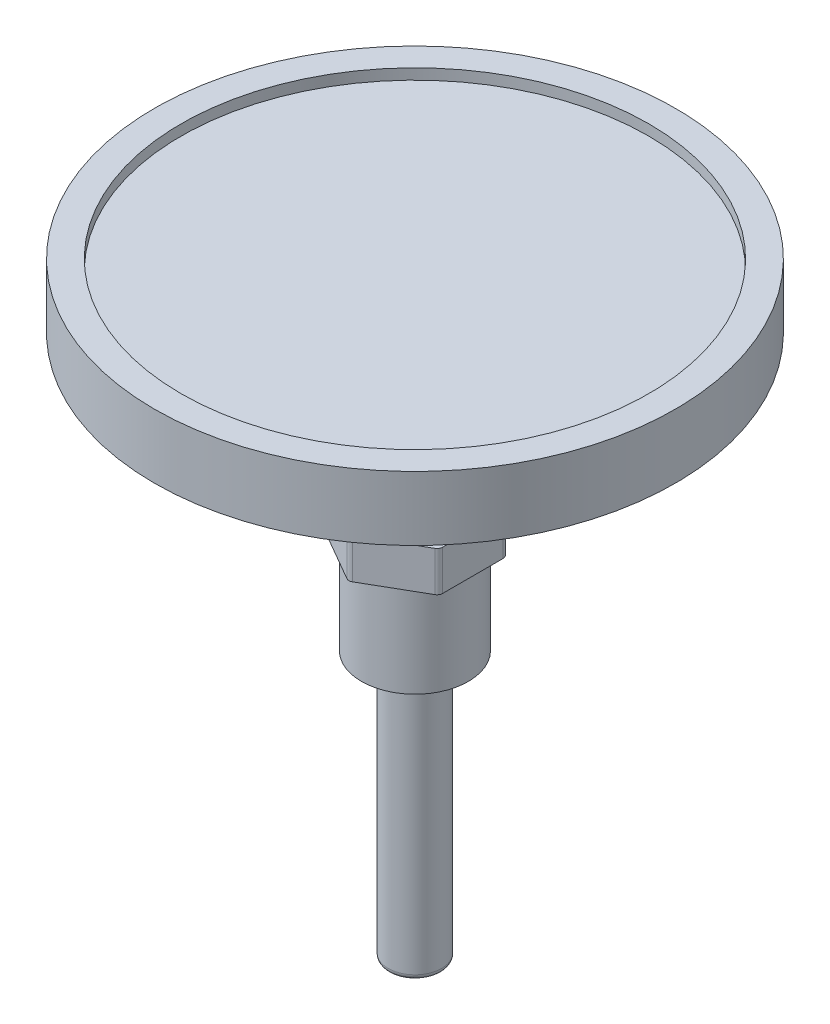
ISO-10303-21;
HEADER;
FILE_DESCRIPTION(('STEP AP214'),'2;1');
FILE_NAME('part.step','',(''),(''),'','','');
FILE_SCHEMA(('AUTOMOTIVE_DESIGN { 1 0 10303 214 1 1 1 1 }'));
ENDSEC;
DATA;
#1=APPLICATION_CONTEXT('core data for automotive mechanical design processes');
#2=APPLICATION_PROTOCOL_DEFINITION('international standard','automotive_design',2000,#1);
#3=PRODUCT_CONTEXT('',#1,'mechanical');
#4=PRODUCT('Part','Part','',(#3));
#5=PRODUCT_RELATED_PRODUCT_CATEGORY('part','',(#4));
#6=PRODUCT_DEFINITION_FORMATION('','',#4);
#7=PRODUCT_DEFINITION_CONTEXT('part definition',#1,'design');
#8=PRODUCT_DEFINITION('design','',#6,#7);
#9=PRODUCT_DEFINITION_SHAPE('','',#8);
#10=(LENGTH_UNIT() NAMED_UNIT(*) SI_UNIT(.MILLI.,.METRE.));
#11=(NAMED_UNIT(*) PLANE_ANGLE_UNIT() SI_UNIT($,.RADIAN.));
#12=(NAMED_UNIT(*) SI_UNIT($,.STERADIAN.) SOLID_ANGLE_UNIT());
#13=UNCERTAINTY_MEASURE_WITH_UNIT(LENGTH_MEASURE(1.E-05),#10,'distance_accuracy_value','');
#14=(GEOMETRIC_REPRESENTATION_CONTEXT(3) GLOBAL_UNCERTAINTY_ASSIGNED_CONTEXT((#13)) GLOBAL_UNIT_ASSIGNED_CONTEXT((#10,
#11,#12)) REPRESENTATION_CONTEXT('',''));
#15=CARTESIAN_POINT('',(0.,0.,0.));
#16=DIRECTION('',(0.,0.,1.));
#17=DIRECTION('',(1.,0.,0.));
#18=AXIS2_PLACEMENT_3D('',#15,#16,#17);
#19=CARTESIAN_POINT('',(0.,75.,0.));
#20=DIRECTION('',(0.,1.,0.));
#21=DIRECTION('',(0.,0.,1.));
#22=AXIS2_PLACEMENT_3D('',#19,#20,#21);
#23=PLANE('',#22);
#24=DIRECTION('',(0.,0.,-1.));
#25=VECTOR('',#24,1.);
#26=CARTESIAN_POINT('',(10.8253175473055,75.,6.25));
#27=LINE('',#26,#25);
#28=CARTESIAN_POINT('',(10.8253175473055,75.,5.67264973081038));
#29=VERTEX_POINT('',#28);
#30=CARTESIAN_POINT('',(10.8253175473055,75.,-5.67264973081037));
#31=VERTEX_POINT('',#30);
#32=EDGE_CURVE('E341',#29,#31,#27,.T.);
#33=ORIENTED_EDGE('',*,*,#32,.T.);
#34=CARTESIAN_POINT('',(9.82531754730547,75.,-5.67264973081037));
#35=DIRECTION('',(0.,1.,0.));
#36=DIRECTION('',(0.,0.,1.));
#37=AXIS2_PLACEMENT_3D('',#34,#35,#36);
#38=CIRCLE('',#37,1.);
#39=CARTESIAN_POINT('',(10.3253175473055,75.,-6.53867513459481));
#40=VERTEX_POINT('',#39);
#41=EDGE_CURVE('E203',#31,#40,#38,.T.);
#42=ORIENTED_EDGE('',*,*,#41,.T.);
#43=DIRECTION('',(-0.866025403784439,0.,-0.5));
#44=VECTOR('',#43,1.);
#45=CARTESIAN_POINT('',(10.8253175473055,75.,-6.25));
#46=LINE('',#45,#44);
#47=CARTESIAN_POINT('',(0.5,75.,-12.2113248654052));
#48=VERTEX_POINT('',#47);
#49=EDGE_CURVE('E147',#40,#48,#46,.T.);
#50=ORIENTED_EDGE('',*,*,#49,.T.);
#51=CARTESIAN_POINT('',(0.,75.,-11.3452994616207));
#52=DIRECTION('',(0.,1.,0.));
#53=DIRECTION('',(0.,0.,1.));
#54=AXIS2_PLACEMENT_3D('',#51,#52,#53);
#55=CIRCLE('',#54,1.);
#56=CARTESIAN_POINT('',(-0.5,75.,-12.2113248654052));
#57=VERTEX_POINT('',#56);
#58=EDGE_CURVE('E194',#48,#57,#55,.T.);
#59=ORIENTED_EDGE('',*,*,#58,.T.);
#60=DIRECTION('',(-0.866025403784439,0.,0.5));
#61=VECTOR('',#60,1.);
#62=CARTESIAN_POINT('',(0.,75.,-12.5));
#63=LINE('',#62,#61);
#64=CARTESIAN_POINT('',(-10.3253175473055,75.,-6.53867513459481));
#65=VERTEX_POINT('',#64);
#66=EDGE_CURVE('E317',#57,#65,#63,.T.);
#67=ORIENTED_EDGE('',*,*,#66,.T.);
#68=CARTESIAN_POINT('',(-9.82531754730548,75.,-5.67264973081037));
#69=DIRECTION('',(0.,1.,0.));
#70=DIRECTION('',(0.,0.,1.));
#71=AXIS2_PLACEMENT_3D('',#68,#69,#70);
#72=CIRCLE('',#71,1.);
#73=CARTESIAN_POINT('',(-10.8253175473055,75.,-5.67264973081037));
#74=VERTEX_POINT('',#73);
#75=EDGE_CURVE('E196',#65,#74,#72,.T.);
#76=ORIENTED_EDGE('',*,*,#75,.T.);
#77=DIRECTION('',(0.,0.,1.));
#78=VECTOR('',#77,1.);
#79=CARTESIAN_POINT('',(-10.8253175473055,75.,-6.25));
#80=LINE('',#79,#78);
#81=CARTESIAN_POINT('',(-10.8253175473055,75.,5.67264973081037));
#82=VERTEX_POINT('',#81);
#83=EDGE_CURVE('E315',#74,#82,#80,.T.);
#84=ORIENTED_EDGE('',*,*,#83,.T.);
#85=CARTESIAN_POINT('',(-9.82531754730548,75.,5.67264973081037));
#86=DIRECTION('',(0.,1.,0.));
#87=DIRECTION('',(0.,0.,1.));
#88=AXIS2_PLACEMENT_3D('',#85,#86,#87);
#89=CIRCLE('',#88,1.);
#90=CARTESIAN_POINT('',(-10.3253175473055,75.,6.53867513459481));
#91=VERTEX_POINT('',#90);
#92=EDGE_CURVE('E58',#82,#91,#89,.T.);
#93=ORIENTED_EDGE('',*,*,#92,.T.);
#94=DIRECTION('',(0.866025403784439,0.,0.5));
#95=VECTOR('',#94,1.);
#96=CARTESIAN_POINT('',(-10.8253175473055,75.,6.25));
#97=LINE('',#96,#95);
#98=CARTESIAN_POINT('',(-0.499999999999999,75.,12.2113248654052));
#99=VERTEX_POINT('',#98);
#100=EDGE_CURVE('E176',#91,#99,#97,.T.);
#101=ORIENTED_EDGE('',*,*,#100,.T.);
#102=CARTESIAN_POINT('',(0.,75.,11.3452994616207));
#103=DIRECTION('',(0.,1.,0.));
#104=DIRECTION('',(0.,0.,1.));
#105=AXIS2_PLACEMENT_3D('',#102,#103,#104);
#106=CIRCLE('',#105,1.);
#107=CARTESIAN_POINT('',(0.500000000000001,75.,12.2113248654052));
#108=VERTEX_POINT('',#107);
#109=EDGE_CURVE('E199',#99,#108,#106,.T.);
#110=ORIENTED_EDGE('',*,*,#109,.T.);
#111=DIRECTION('',(0.866025403784439,0.,-0.5));
#112=VECTOR('',#111,1.);
#113=CARTESIAN_POINT('',(0.,75.,12.5));
#114=LINE('',#113,#112);
#115=CARTESIAN_POINT('',(10.3253175473055,75.,6.53867513459481));
#116=VERTEX_POINT('',#115);
#117=EDGE_CURVE('E168',#108,#116,#114,.T.);
#118=ORIENTED_EDGE('',*,*,#117,.T.);
#119=CARTESIAN_POINT('',(9.82531754730547,75.,5.67264973081038));
#120=DIRECTION('',(0.,1.,0.));
#121=DIRECTION('',(0.,0.,1.));
#122=AXIS2_PLACEMENT_3D('',#119,#120,#121);
#123=CIRCLE('',#122,1.);
#124=EDGE_CURVE('E201',#116,#29,#123,.T.);
#125=ORIENTED_EDGE('',*,*,#124,.T.);
#126=EDGE_LOOP('',(#33,#42,#50,#59,#67,#76,#84,#93,#101,#110,#118,#125));
#127=FACE_BOUND('',#126,.T.);
#128=CARTESIAN_POINT('',(0.,75.,0.));
#129=DIRECTION('',(0.,1.,0.));
#130=DIRECTION('',(0.,0.,1.));
#131=AXIS2_PLACEMENT_3D('',#128,#129,#130);
#132=CIRCLE('',#131,8.5);
#133=CARTESIAN_POINT('',(0.,75.,8.5));
#134=VERTEX_POINT('',#133);
#135=EDGE_CURVE('E329',#134,#134,#132,.T.);
#136=ORIENTED_EDGE('',*,*,#135,.F.);
#137=EDGE_LOOP('',(#136));
#138=FACE_BOUND('',#137,.T.);
#139=ADVANCED_FACE('F36',(#127,#138),#23,.T.);
#140=CARTESIAN_POINT('',(0.,50.,0.));
#141=DIRECTION('',(0.,-1.,0.));
#142=DIRECTION('',(0.,0.,-1.));
#143=AXIS2_PLACEMENT_3D('',#140,#141,#142);
#144=CYLINDRICAL_SURFACE('',#143,5.);
#145=CARTESIAN_POINT('',(0.,1.,0.));
#146=DIRECTION('',(0.,1.,0.));
#147=DIRECTION('',(0.,0.,1.));
#148=AXIS2_PLACEMENT_3D('',#145,#146,#147);
#149=CIRCLE('',#148,5.);
#150=CARTESIAN_POINT('',(0.,1.,5.));
#151=VERTEX_POINT('',#150);
#152=EDGE_CURVE('E44',#151,#151,#149,.T.);
#153=ORIENTED_EDGE('',*,*,#152,.T.);
#154=EDGE_LOOP('',(#153));
#155=FACE_BOUND('',#154,.T.);
#156=CARTESIAN_POINT('',(0.,50.,0.));
#157=DIRECTION('',(0.,1.,0.));
#158=DIRECTION('',(0.,0.,1.));
#159=AXIS2_PLACEMENT_3D('',#156,#157,#158);
#160=CIRCLE('',#159,5.);
#161=CARTESIAN_POINT('',(0.,50.,5.));
#162=VERTEX_POINT('',#161);
#163=EDGE_CURVE('E172',#162,#162,#160,.T.);
#164=ORIENTED_EDGE('',*,*,#163,.F.);
#165=EDGE_LOOP('',(#164));
#166=FACE_BOUND('',#165,.T.);
#167=ADVANCED_FACE('F226',(#155,#166),#144,.T.);
#168=CARTESIAN_POINT('',(0.,0.,0.));
#169=DIRECTION('',(0.,1.,0.));
#170=DIRECTION('',(0.,0.,1.));
#171=AXIS2_PLACEMENT_3D('',#168,#169,#170);
#172=PLANE('',#171);
#173=CARTESIAN_POINT('',(0.,0.,0.));
#174=DIRECTION('',(0.,1.,0.));
#175=DIRECTION('',(0.,0.,1.));
#176=AXIS2_PLACEMENT_3D('',#173,#174,#175);
#177=CIRCLE('',#176,4.);
#178=CARTESIAN_POINT('',(0.,0.,4.));
#179=VERTEX_POINT('',#178);
#180=EDGE_CURVE('E11',#179,#179,#177,.F.);
#181=ORIENTED_EDGE('',*,*,#180,.T.);
#182=EDGE_LOOP('',(#181));
#183=FACE_BOUND('',#182,.T.);
#184=ADVANCED_FACE('F243',(#183),#172,.F.);
#185=CARTESIAN_POINT('',(0.,50.,0.));
#186=DIRECTION('',(0.,1.,0.));
#187=DIRECTION('',(0.,0.,1.));
#188=AXIS2_PLACEMENT_3D('',#185,#186,#187);
#189=PLANE('',#188);
#190=CARTESIAN_POINT('',(0.,50.,0.));
#191=DIRECTION('',(0.,1.,0.));
#192=DIRECTION('',(0.,0.,1.));
#193=AXIS2_PLACEMENT_3D('',#190,#191,#192);
#194=CIRCLE('',#193,10.);
#195=CARTESIAN_POINT('',(0.,50.,10.));
#196=VERTEX_POINT('',#195);
#197=EDGE_CURVE('E173',#196,#196,#194,.T.);
#198=ORIENTED_EDGE('',*,*,#197,.F.);
#199=EDGE_LOOP('',(#198));
#200=FACE_BOUND('',#199,.T.);
#201=ORIENTED_EDGE('',*,*,#163,.T.);
#202=EDGE_LOOP('',(#201));
#203=FACE_BOUND('',#202,.T.);
#204=ADVANCED_FACE('F275',(#200,#203),#189,.F.);
#205=CARTESIAN_POINT('',(0.,67.5,0.));
#206=DIRECTION('',(0.,-1.,0.));
#207=DIRECTION('',(0.,0.,-1.));
#208=AXIS2_PLACEMENT_3D('',#205,#206,#207);
#209=CYLINDRICAL_SURFACE('',#208,10.);
#210=CARTESIAN_POINT('',(0.,67.5,0.));
#211=DIRECTION('',(0.,1.,0.));
#212=DIRECTION('',(0.,0.,1.));
#213=AXIS2_PLACEMENT_3D('',#210,#211,#212);
#214=CIRCLE('',#213,10.);
#215=CARTESIAN_POINT('',(0.,67.5,10.));
#216=VERTEX_POINT('',#215);
#217=EDGE_CURVE('E169',#216,#216,#214,.T.);
#218=ORIENTED_EDGE('',*,*,#217,.F.);
#219=EDGE_LOOP('',(#218));
#220=FACE_BOUND('',#219,.T.);
#221=ORIENTED_EDGE('',*,*,#197,.T.);
#222=EDGE_LOOP('',(#221));
#223=FACE_BOUND('',#222,.T.);
#224=ADVANCED_FACE('F254',(#220,#223),#209,.T.);
#225=CARTESIAN_POINT('',(0.,67.5,0.));
#226=DIRECTION('',(0.,1.,0.));
#227=DIRECTION('',(0.,0.,1.));
#228=AXIS2_PLACEMENT_3D('',#225,#226,#227);
#229=PLANE('',#228);
#230=DIRECTION('',(-0.866025403784439,0.,-0.5));
#231=VECTOR('',#230,1.);
#232=CARTESIAN_POINT('',(10.8253175473055,67.5,-6.25));
#233=LINE('',#232,#231);
#234=CARTESIAN_POINT('',(10.3253175473055,67.5,-6.53867513459481));
#235=VERTEX_POINT('',#234);
#236=CARTESIAN_POINT('',(0.5,67.5,-12.2113248654052));
#237=VERTEX_POINT('',#236);
#238=EDGE_CURVE('E144',#235,#237,#233,.T.);
#239=ORIENTED_EDGE('',*,*,#238,.F.);
#240=CARTESIAN_POINT('',(9.82531754730547,67.5,-5.67264973081037));
#241=DIRECTION('',(0.,1.,0.));
#242=DIRECTION('',(0.,0.,1.));
#243=AXIS2_PLACEMENT_3D('',#240,#241,#242);
#244=CIRCLE('',#243,1.);
#245=CARTESIAN_POINT('',(10.8253175473055,67.5,-5.67264973081037));
#246=VERTEX_POINT('',#245);
#247=EDGE_CURVE('E127',#235,#246,#244,.F.);
#248=ORIENTED_EDGE('',*,*,#247,.T.);
#249=DIRECTION('',(0.,0.,-1.));
#250=VECTOR('',#249,1.);
#251=CARTESIAN_POINT('',(10.8253175473055,67.5,6.25));
#252=LINE('',#251,#250);
#253=CARTESIAN_POINT('',(10.8253175473055,67.5,5.67264973081038));
#254=VERTEX_POINT('',#253);
#255=EDGE_CURVE('E155',#254,#246,#252,.T.);
#256=ORIENTED_EDGE('',*,*,#255,.F.);
#257=CARTESIAN_POINT('',(9.82531754730547,67.5,5.67264973081038));
#258=DIRECTION('',(0.,1.,0.));
#259=DIRECTION('',(0.,0.,1.));
#260=AXIS2_PLACEMENT_3D('',#257,#258,#259);
#261=CIRCLE('',#260,1.);
#262=CARTESIAN_POINT('',(10.3253175473055,67.5,6.53867513459481));
#263=VERTEX_POINT('',#262);
#264=EDGE_CURVE('E138',#254,#263,#261,.F.);
#265=ORIENTED_EDGE('',*,*,#264,.T.);
#266=DIRECTION('',(0.866025403784439,0.,-0.5));
#267=VECTOR('',#266,1.);
#268=CARTESIAN_POINT('',(0.,67.5,12.5));
#269=LINE('',#268,#267);
#270=CARTESIAN_POINT('',(0.500000000000001,67.5,12.2113248654052));
#271=VERTEX_POINT('',#270);
#272=EDGE_CURVE('E160',#271,#263,#269,.T.);
#273=ORIENTED_EDGE('',*,*,#272,.F.);
#274=CARTESIAN_POINT('',(0.,67.5,11.3452994616207));
#275=DIRECTION('',(0.,1.,0.));
#276=DIRECTION('',(0.,0.,1.));
#277=AXIS2_PLACEMENT_3D('',#274,#275,#276);
#278=CIRCLE('',#277,1.);
#279=CARTESIAN_POINT('',(-0.499999999999999,67.5,12.2113248654052));
#280=VERTEX_POINT('',#279);
#281=EDGE_CURVE('E188',#271,#280,#278,.F.);
#282=ORIENTED_EDGE('',*,*,#281,.T.);
#283=DIRECTION('',(0.866025403784439,0.,0.5));
#284=VECTOR('',#283,1.);
#285=CARTESIAN_POINT('',(-10.8253175473055,67.5,6.25));
#286=LINE('',#285,#284);
#287=CARTESIAN_POINT('',(-10.3253175473055,67.5,6.53867513459481));
#288=VERTEX_POINT('',#287);
#289=EDGE_CURVE('E166',#288,#280,#286,.T.);
#290=ORIENTED_EDGE('',*,*,#289,.F.);
#291=CARTESIAN_POINT('',(-9.82531754730548,67.5,5.67264973081037));
#292=DIRECTION('',(0.,1.,0.));
#293=DIRECTION('',(0.,0.,1.));
#294=AXIS2_PLACEMENT_3D('',#291,#292,#293);
#295=CIRCLE('',#294,1.);
#296=CARTESIAN_POINT('',(-10.8253175473055,67.5,5.67264973081037));
#297=VERTEX_POINT('',#296);
#298=EDGE_CURVE('E186',#288,#297,#295,.F.);
#299=ORIENTED_EDGE('',*,*,#298,.T.);
#300=DIRECTION('',(0.,0.,1.));
#301=VECTOR('',#300,1.);
#302=CARTESIAN_POINT('',(-10.8253175473055,67.5,-6.25));
#303=LINE('',#302,#301);
#304=CARTESIAN_POINT('',(-10.8253175473055,67.5,-5.67264973081037));
#305=VERTEX_POINT('',#304);
#306=EDGE_CURVE('E158',#305,#297,#303,.T.);
#307=ORIENTED_EDGE('',*,*,#306,.F.);
#308=CARTESIAN_POINT('',(-9.82531754730548,67.5,-5.67264973081037));
#309=DIRECTION('',(0.,1.,0.));
#310=DIRECTION('',(0.,0.,1.));
#311=AXIS2_PLACEMENT_3D('',#308,#309,#310);
#312=CIRCLE('',#311,1.);
#313=CARTESIAN_POINT('',(-10.3253175473055,67.5,-6.53867513459481));
#314=VERTEX_POINT('',#313);
#315=EDGE_CURVE('E184',#305,#314,#312,.F.);
#316=ORIENTED_EDGE('',*,*,#315,.T.);
#317=DIRECTION('',(-0.866025403784439,0.,0.5));
#318=VECTOR('',#317,1.);
#319=CARTESIAN_POINT('',(0.,67.5,-12.5));
#320=LINE('',#319,#318);
#321=CARTESIAN_POINT('',(-0.5,67.5,-12.2113248654052));
#322=VERTEX_POINT('',#321);
#323=EDGE_CURVE('E154',#322,#314,#320,.T.);
#324=ORIENTED_EDGE('',*,*,#323,.F.);
#325=CARTESIAN_POINT('',(0.,67.5,-11.3452994616207));
#326=DIRECTION('',(0.,1.,0.));
#327=DIRECTION('',(0.,0.,1.));
#328=AXIS2_PLACEMENT_3D('',#325,#326,#327);
#329=CIRCLE('',#328,1.);
#330=EDGE_CURVE('E148',#322,#237,#329,.F.);
#331=ORIENTED_EDGE('',*,*,#330,.T.);
#332=EDGE_LOOP('',(#239,#248,#256,#265,#273,#282,#290,#299,#307,#316,#324,#331));
#333=FACE_BOUND('',#332,.T.);
#334=ORIENTED_EDGE('',*,*,#217,.T.);
#335=EDGE_LOOP('',(#334));
#336=FACE_BOUND('',#335,.T.);
#337=ADVANCED_FACE('F151',(#333,#336),#229,.F.);
#338=CARTESIAN_POINT('',(0.,75.,12.5));
#339=DIRECTION('',(-0.5,0.,-0.866025403784439));
#340=DIRECTION('',(-0.866025403784439,0.,0.5));
#341=AXIS2_PLACEMENT_3D('',#338,#339,#340);
#342=PLANE('',#341);
#343=ORIENTED_EDGE('',*,*,#272,.T.);
#344=DIRECTION('',(0.,-1.,0.));
#345=VECTOR('',#344,1.);
#346=CARTESIAN_POINT('',(10.3253175473055,75.,6.53867513459481));
#347=LINE('',#346,#345);
#348=EDGE_CURVE('E208',#263,#116,#347,.F.);
#349=ORIENTED_EDGE('',*,*,#348,.T.);
#350=ORIENTED_EDGE('',*,*,#117,.F.);
#351=DIRECTION('',(0.,-1.,0.));
#352=VECTOR('',#351,1.);
#353=CARTESIAN_POINT('',(0.500000000000001,75.,12.2113248654052));
#354=LINE('',#353,#352);
#355=EDGE_CURVE('E205',#108,#271,#354,.T.);
#356=ORIENTED_EDGE('',*,*,#355,.T.);
#357=EDGE_LOOP('',(#343,#349,#350,#356));
#358=FACE_BOUND('',#357,.T.);
#359=ADVANCED_FACE('F253',(#358),#342,.F.);
#360=CARTESIAN_POINT('',(10.8253175473055,75.,6.25));
#361=DIRECTION('',(-1.,0.,0.));
#362=DIRECTION('',(0.,0.,1.));
#363=AXIS2_PLACEMENT_3D('',#360,#361,#362);
#364=PLANE('',#363);
#365=ORIENTED_EDGE('',*,*,#255,.T.);
#366=DIRECTION('',(0.,-1.,0.));
#367=VECTOR('',#366,1.);
#368=CARTESIAN_POINT('',(10.8253175473055,75.,-5.67264973081037));
#369=LINE('',#368,#367);
#370=EDGE_CURVE('E132',#246,#31,#369,.F.);
#371=ORIENTED_EDGE('',*,*,#370,.T.);
#372=ORIENTED_EDGE('',*,*,#32,.F.);
#373=DIRECTION('',(0.,-1.,0.));
#374=VECTOR('',#373,1.);
#375=CARTESIAN_POINT('',(10.8253175473055,75.,5.67264973081038));
#376=LINE('',#375,#374);
#377=EDGE_CURVE('E137',#29,#254,#376,.T.);
#378=ORIENTED_EDGE('',*,*,#377,.T.);
#379=EDGE_LOOP('',(#365,#371,#372,#378));
#380=FACE_BOUND('',#379,.T.);
#381=ADVANCED_FACE('F268',(#380),#364,.F.);
#382=CARTESIAN_POINT('',(10.8253175473055,75.,-6.25));
#383=DIRECTION('',(-0.5,0.,0.866025403784439));
#384=DIRECTION('',(0.866025403784439,0.,0.5));
#385=AXIS2_PLACEMENT_3D('',#382,#383,#384);
#386=PLANE('',#385);
#387=ORIENTED_EDGE('',*,*,#49,.F.);
#388=DIRECTION('',(0.,-1.,0.));
#389=VECTOR('',#388,1.);
#390=CARTESIAN_POINT('',(10.3253175473055,75.,-6.53867513459481));
#391=LINE('',#390,#389);
#392=EDGE_CURVE('E131',#40,#235,#391,.T.);
#393=ORIENTED_EDGE('',*,*,#392,.T.);
#394=ORIENTED_EDGE('',*,*,#238,.T.);
#395=DIRECTION('',(0.,-1.,0.));
#396=VECTOR('',#395,1.);
#397=CARTESIAN_POINT('',(0.500000000000002,75.,-12.2113248654052));
#398=LINE('',#397,#396);
#399=EDGE_CURVE('E149',#237,#48,#398,.F.);
#400=ORIENTED_EDGE('',*,*,#399,.T.);
#401=EDGE_LOOP('',(#387,#393,#394,#400));
#402=FACE_BOUND('',#401,.T.);
#403=ADVANCED_FACE('F143',(#402),#386,.F.);
#404=CARTESIAN_POINT('',(0.,75.,-12.5));
#405=DIRECTION('',(0.5,0.,0.866025403784439));
#406=DIRECTION('',(0.866025403784439,0.,-0.5));
#407=AXIS2_PLACEMENT_3D('',#404,#405,#406);
#408=PLANE('',#407);
#409=ORIENTED_EDGE('',*,*,#323,.T.);
#410=DIRECTION('',(0.,-1.,0.));
#411=VECTOR('',#410,1.);
#412=CARTESIAN_POINT('',(-10.3253175473055,75.,-6.53867513459481));
#413=LINE('',#412,#411);
#414=EDGE_CURVE('E222',#314,#65,#413,.F.);
#415=ORIENTED_EDGE('',*,*,#414,.T.);
#416=ORIENTED_EDGE('',*,*,#66,.F.);
#417=DIRECTION('',(0.,-1.,0.));
#418=VECTOR('',#417,1.);
#419=CARTESIAN_POINT('',(-0.5,75.,-12.2113248654052));
#420=LINE('',#419,#418);
#421=EDGE_CURVE('E219',#57,#322,#420,.T.);
#422=ORIENTED_EDGE('',*,*,#421,.T.);
#423=EDGE_LOOP('',(#409,#415,#416,#422));
#424=FACE_BOUND('',#423,.T.);
#425=ADVANCED_FACE('F261',(#424),#408,.F.);
#426=CARTESIAN_POINT('',(-10.8253175473055,75.,-6.25));
#427=DIRECTION('',(1.,0.,0.));
#428=DIRECTION('',(0.,0.,-1.));
#429=AXIS2_PLACEMENT_3D('',#426,#427,#428);
#430=PLANE('',#429);
#431=ORIENTED_EDGE('',*,*,#306,.T.);
#432=DIRECTION('',(0.,-1.,0.));
#433=VECTOR('',#432,1.);
#434=CARTESIAN_POINT('',(-10.8253175473055,75.,5.67264973081037));
#435=LINE('',#434,#433);
#436=EDGE_CURVE('E217',#297,#82,#435,.F.);
#437=ORIENTED_EDGE('',*,*,#436,.T.);
#438=ORIENTED_EDGE('',*,*,#83,.F.);
#439=DIRECTION('',(0.,-1.,0.));
#440=VECTOR('',#439,1.);
#441=CARTESIAN_POINT('',(-10.8253175473055,75.,-5.67264973081037));
#442=LINE('',#441,#440);
#443=EDGE_CURVE('E214',#74,#305,#442,.T.);
#444=ORIENTED_EDGE('',*,*,#443,.T.);
#445=EDGE_LOOP('',(#431,#437,#438,#444));
#446=FACE_BOUND('',#445,.T.);
#447=ADVANCED_FACE('F258',(#446),#430,.F.);
#448=CARTESIAN_POINT('',(-10.8253175473055,75.,6.25));
#449=DIRECTION('',(0.5,0.,-0.866025403784439));
#450=DIRECTION('',(-0.866025403784439,0.,-0.5));
#451=AXIS2_PLACEMENT_3D('',#448,#449,#450);
#452=PLANE('',#451);
#453=ORIENTED_EDGE('',*,*,#289,.T.);
#454=DIRECTION('',(0.,-1.,0.));
#455=VECTOR('',#454,1.);
#456=CARTESIAN_POINT('',(-0.5,75.,12.2113248654052));
#457=LINE('',#456,#455);
#458=EDGE_CURVE('E51',#280,#99,#457,.F.);
#459=ORIENTED_EDGE('',*,*,#458,.T.);
#460=ORIENTED_EDGE('',*,*,#100,.F.);
#461=DIRECTION('',(0.,-1.,0.));
#462=VECTOR('',#461,1.);
#463=CARTESIAN_POINT('',(-10.3253175473055,75.,6.53867513459481));
#464=LINE('',#463,#462);
#465=EDGE_CURVE('E210',#91,#288,#464,.T.);
#466=ORIENTED_EDGE('',*,*,#465,.T.);
#467=EDGE_LOOP('',(#453,#459,#460,#466));
#468=FACE_BOUND('',#467,.T.);
#469=ADVANCED_FACE('F255',(#468),#452,.F.);
#470=CARTESIAN_POINT('',(0.,91.5,0.));
#471=DIRECTION('',(0.,-1.,0.));
#472=DIRECTION('',(0.,0.,-1.));
#473=AXIS2_PLACEMENT_3D('',#470,#471,#472);
#474=CYLINDRICAL_SURFACE('',#473,8.5);
#475=CARTESIAN_POINT('',(0.,91.5,0.));
#476=DIRECTION('',(0.,1.,0.));
#477=DIRECTION('',(0.,0.,1.));
#478=AXIS2_PLACEMENT_3D('',#475,#476,#477);
#479=CIRCLE('',#478,8.5);
#480=CARTESIAN_POINT('',(0.,91.5,8.5));
#481=VERTEX_POINT('',#480);
#482=EDGE_CURVE('E325',#481,#481,#479,.T.);
#483=ORIENTED_EDGE('',*,*,#482,.F.);
#484=EDGE_LOOP('',(#483));
#485=FACE_BOUND('',#484,.T.);
#486=ORIENTED_EDGE('',*,*,#135,.T.);
#487=EDGE_LOOP('',(#486));
#488=FACE_BOUND('',#487,.T.);
#489=ADVANCED_FACE('F249',(#485,#488),#474,.T.);
#490=CARTESIAN_POINT('',(0.,91.5,0.));
#491=DIRECTION('',(0.,1.,0.));
#492=DIRECTION('',(0.,0.,1.));
#493=AXIS2_PLACEMENT_3D('',#490,#491,#492);
#494=PLANE('',#493);
#495=CARTESIAN_POINT('',(0.,91.5,0.));
#496=DIRECTION('',(0.,1.,0.));
#497=DIRECTION('',(0.,0.,1.));
#498=AXIS2_PLACEMENT_3D('',#495,#496,#497);
#499=CIRCLE('',#498,20.);
#500=CARTESIAN_POINT('',(0.,91.5,20.));
#501=VERTEX_POINT('',#500);
#502=EDGE_CURVE('E334',#501,#501,#499,.T.);
#503=ORIENTED_EDGE('',*,*,#502,.F.);
#504=EDGE_LOOP('',(#503));
#505=FACE_BOUND('',#504,.T.);
#506=ORIENTED_EDGE('',*,*,#482,.T.);
#507=EDGE_LOOP('',(#506));
#508=FACE_BOUND('',#507,.T.);
#509=ADVANCED_FACE('F385',(#505,#508),#494,.F.);
#510=CARTESIAN_POINT('',(0.,101.5,0.));
#511=DIRECTION('',(0.,1.,0.));
#512=DIRECTION('',(0.,0.,1.));
#513=AXIS2_PLACEMENT_3D('',#510,#511,#512);
#514=PLANE('',#513);
#515=CARTESIAN_POINT('',(0.,101.5,0.));
#516=DIRECTION('',(0.,1.,0.));
#517=DIRECTION('',(0.,0.,1.));
#518=AXIS2_PLACEMENT_3D('',#515,#516,#517);
#519=CIRCLE('',#518,34.2814800674212);
#520=CARTESIAN_POINT('',(0.,101.5,34.2814800674212));
#521=VERTEX_POINT('',#520);
#522=EDGE_CURVE('E179',#521,#521,#519,.T.);
#523=ORIENTED_EDGE('',*,*,#522,.T.);
#524=EDGE_LOOP('',(#523));
#525=FACE_BOUND('',#524,.T.);
#526=CARTESIAN_POINT('',(0.,101.5,0.));
#527=DIRECTION('',(0.,1.,0.));
#528=DIRECTION('',(0.,0.,1.));
#529=AXIS2_PLACEMENT_3D('',#526,#527,#528);
#530=CIRCLE('',#529,48.75);
#531=CARTESIAN_POINT('',(0.,101.5,48.75));
#532=VERTEX_POINT('',#531);
#533=EDGE_CURVE('E354',#532,#532,#530,.T.);
#534=ORIENTED_EDGE('',*,*,#533,.F.);
#535=EDGE_LOOP('',(#534));
#536=FACE_BOUND('',#535,.T.);
#537=ADVANCED_FACE('F380',(#525,#536),#514,.F.);
#538=CARTESIAN_POINT('',(0.,113.5,0.));
#539=DIRECTION('',(0.,-1.,0.));
#540=DIRECTION('',(0.,0.,-1.));
#541=AXIS2_PLACEMENT_3D('',#538,#539,#540);
#542=CYLINDRICAL_SURFACE('',#541,48.75);
#543=CARTESIAN_POINT('',(0.,113.5,0.));
#544=DIRECTION('',(0.,1.,0.));
#545=DIRECTION('',(0.,0.,1.));
#546=AXIS2_PLACEMENT_3D('',#543,#544,#545);
#547=CIRCLE('',#546,48.75);
#548=CARTESIAN_POINT('',(0.,113.5,48.75));
#549=VERTEX_POINT('',#548);
#550=EDGE_CURVE('E353',#549,#549,#547,.T.);
#551=ORIENTED_EDGE('',*,*,#550,.F.);
#552=EDGE_LOOP('',(#551));
#553=FACE_BOUND('',#552,.T.);
#554=ORIENTED_EDGE('',*,*,#533,.T.);
#555=EDGE_LOOP('',(#554));
#556=FACE_BOUND('',#555,.T.);
#557=ADVANCED_FACE('F374',(#553,#556),#542,.T.);
#558=CARTESIAN_POINT('',(0.,113.5,0.));
#559=DIRECTION('',(0.,1.,0.));
#560=DIRECTION('',(0.,0.,1.));
#561=AXIS2_PLACEMENT_3D('',#558,#559,#560);
#562=PLANE('',#561);
#563=CARTESIAN_POINT('',(0.,113.5,0.));
#564=DIRECTION('',(0.,1.,0.));
#565=DIRECTION('',(0.,0.,1.));
#566=AXIS2_PLACEMENT_3D('',#563,#564,#565);
#567=CIRCLE('',#566,43.75);
#568=CARTESIAN_POINT('',(0.,113.5,43.75));
#569=VERTEX_POINT('',#568);
#570=EDGE_CURVE('E360',#569,#569,#567,.T.);
#571=ORIENTED_EDGE('',*,*,#570,.F.);
#572=EDGE_LOOP('',(#571));
#573=FACE_BOUND('',#572,.T.);
#574=ORIENTED_EDGE('',*,*,#550,.T.);
#575=EDGE_LOOP('',(#574));
#576=FACE_BOUND('',#575,.T.);
#577=ADVANCED_FACE('F289',(#573,#576),#562,.T.);
#578=CARTESIAN_POINT('',(0.,101.5,0.));
#579=DIRECTION('',(0.,1.,0.));
#580=DIRECTION('',(0.,0.,1.));
#581=AXIS2_PLACEMENT_3D('',#578,#579,#580);
#582=CONICAL_SURFACE('',#581,34.2814800674212,0.959931088596888);
#583=ORIENTED_EDGE('',*,*,#502,.T.);
#584=EDGE_LOOP('',(#583));
#585=FACE_BOUND('',#584,.T.);
#586=ORIENTED_EDGE('',*,*,#522,.F.);
#587=EDGE_LOOP('',(#586));
#588=FACE_BOUND('',#587,.T.);
#589=ADVANCED_FACE('F285',(#585,#588),#582,.T.);
#590=CARTESIAN_POINT('',(0.,111.5,0.));
#591=DIRECTION('',(0.,1.,0.));
#592=DIRECTION('',(0.,0.,1.));
#593=AXIS2_PLACEMENT_3D('',#590,#591,#592);
#594=CYLINDRICAL_SURFACE('',#593,43.75);
#595=CARTESIAN_POINT('',(0.,111.5,0.));
#596=DIRECTION('',(0.,1.,0.));
#597=DIRECTION('',(0.,0.,1.));
#598=AXIS2_PLACEMENT_3D('',#595,#596,#597);
#599=CIRCLE('',#598,43.75);
#600=CARTESIAN_POINT('',(0.,111.5,43.75));
#601=VERTEX_POINT('',#600);
#602=EDGE_CURVE('E357',#601,#601,#599,.T.);
#603=ORIENTED_EDGE('',*,*,#602,.F.);
#604=EDGE_LOOP('',(#603));
#605=FACE_BOUND('',#604,.T.);
#606=ORIENTED_EDGE('',*,*,#570,.T.);
#607=EDGE_LOOP('',(#606));
#608=FACE_BOUND('',#607,.T.);
#609=ADVANCED_FACE('F288',(#605,#608),#594,.F.);
#610=CARTESIAN_POINT('',(0.,111.5,0.));
#611=DIRECTION('',(0.,1.,0.));
#612=DIRECTION('',(0.,0.,1.));
#613=AXIS2_PLACEMENT_3D('',#610,#611,#612);
#614=PLANE('',#613);
#615=ORIENTED_EDGE('',*,*,#602,.T.);
#616=EDGE_LOOP('',(#615));
#617=FACE_BOUND('',#616,.T.);
#618=ADVANCED_FACE('F294',(#617),#614,.T.);
#619=CARTESIAN_POINT('',(9.82531754730547,75.,-5.67264973081037));
#620=DIRECTION('',(0.,-1.,0.));
#621=DIRECTION('',(0.,0.,-1.));
#622=AXIS2_PLACEMENT_3D('',#619,#620,#621);
#623=CYLINDRICAL_SURFACE('',#622,1.);
#624=ORIENTED_EDGE('',*,*,#41,.F.);
#625=ORIENTED_EDGE('',*,*,#370,.F.);
#626=ORIENTED_EDGE('',*,*,#247,.F.);
#627=ORIENTED_EDGE('',*,*,#392,.F.);
#628=EDGE_LOOP('',(#624,#625,#626,#627));
#629=FACE_BOUND('',#628,.T.);
#630=ADVANCED_FACE('F130',(#629),#623,.T.);
#631=CARTESIAN_POINT('',(9.82531754730547,75.,5.67264973081038));
#632=DIRECTION('',(0.,-1.,0.));
#633=DIRECTION('',(0.,0.,-1.));
#634=AXIS2_PLACEMENT_3D('',#631,#632,#633);
#635=CYLINDRICAL_SURFACE('',#634,1.);
#636=ORIENTED_EDGE('',*,*,#124,.F.);
#637=ORIENTED_EDGE('',*,*,#348,.F.);
#638=ORIENTED_EDGE('',*,*,#264,.F.);
#639=ORIENTED_EDGE('',*,*,#377,.F.);
#640=EDGE_LOOP('',(#636,#637,#638,#639));
#641=FACE_BOUND('',#640,.T.);
#642=ADVANCED_FACE('F293',(#641),#635,.T.);
#643=CARTESIAN_POINT('',(0.,75.,11.3452994616207));
#644=DIRECTION('',(0.,-1.,0.));
#645=DIRECTION('',(0.,0.,-1.));
#646=AXIS2_PLACEMENT_3D('',#643,#644,#645);
#647=CYLINDRICAL_SURFACE('',#646,1.);
#648=ORIENTED_EDGE('',*,*,#109,.F.);
#649=ORIENTED_EDGE('',*,*,#458,.F.);
#650=ORIENTED_EDGE('',*,*,#281,.F.);
#651=ORIENTED_EDGE('',*,*,#355,.F.);
#652=EDGE_LOOP('',(#648,#649,#650,#651));
#653=FACE_BOUND('',#652,.T.);
#654=ADVANCED_FACE('F297',(#653),#647,.T.);
#655=CARTESIAN_POINT('',(-9.82531754730548,75.,5.67264973081037));
#656=DIRECTION('',(0.,-1.,0.));
#657=DIRECTION('',(0.,0.,-1.));
#658=AXIS2_PLACEMENT_3D('',#655,#656,#657);
#659=CYLINDRICAL_SURFACE('',#658,1.);
#660=ORIENTED_EDGE('',*,*,#92,.F.);
#661=ORIENTED_EDGE('',*,*,#436,.F.);
#662=ORIENTED_EDGE('',*,*,#298,.F.);
#663=ORIENTED_EDGE('',*,*,#465,.F.);
#664=EDGE_LOOP('',(#660,#661,#662,#663));
#665=FACE_BOUND('',#664,.T.);
#666=ADVANCED_FACE('F301',(#665),#659,.T.);
#667=CARTESIAN_POINT('',(-9.82531754730548,75.,-5.67264973081037));
#668=DIRECTION('',(0.,-1.,0.));
#669=DIRECTION('',(0.,0.,-1.));
#670=AXIS2_PLACEMENT_3D('',#667,#668,#669);
#671=CYLINDRICAL_SURFACE('',#670,1.);
#672=ORIENTED_EDGE('',*,*,#75,.F.);
#673=ORIENTED_EDGE('',*,*,#414,.F.);
#674=ORIENTED_EDGE('',*,*,#315,.F.);
#675=ORIENTED_EDGE('',*,*,#443,.F.);
#676=EDGE_LOOP('',(#672,#673,#674,#675));
#677=FACE_BOUND('',#676,.T.);
#678=ADVANCED_FACE('F235',(#677),#671,.T.);
#679=CARTESIAN_POINT('',(0.,75.,-11.3452994616207));
#680=DIRECTION('',(0.,-1.,0.));
#681=DIRECTION('',(0.,0.,-1.));
#682=AXIS2_PLACEMENT_3D('',#679,#680,#681);
#683=CYLINDRICAL_SURFACE('',#682,1.);
#684=ORIENTED_EDGE('',*,*,#58,.F.);
#685=ORIENTED_EDGE('',*,*,#399,.F.);
#686=ORIENTED_EDGE('',*,*,#330,.F.);
#687=ORIENTED_EDGE('',*,*,#421,.F.);
#688=EDGE_LOOP('',(#684,#685,#686,#687));
#689=FACE_BOUND('',#688,.T.);
#690=ADVANCED_FACE('F230',(#689),#683,.T.);
#691=CARTESIAN_POINT('',(0.,1.,0.));
#692=DIRECTION('',(0.,1.,0.));
#693=DIRECTION('',(0.,0.,1.));
#694=AXIS2_PLACEMENT_3D('',#691,#692,#693);
#695=TOROIDAL_SURFACE('',#694,4.,1.);
#696=ORIENTED_EDGE('',*,*,#180,.F.);
#697=EDGE_LOOP('',(#696));
#698=FACE_BOUND('',#697,.T.);
#699=ORIENTED_EDGE('',*,*,#152,.F.);
#700=EDGE_LOOP('',(#699));
#701=FACE_BOUND('',#700,.T.);
#702=ADVANCED_FACE('F38',(#698,#701),#695,.T.);
#703=CLOSED_SHELL('',(#139,#167,#184,#204,#224,#337,#359,#381,#403,#425,#447,#469,#489,#509,
#537,#557,#577,#589,#609,#618,#630,#642,#654,#666,#678,#690,#702));
#704=MANIFOLD_SOLID_BREP('B2',#703);
#705=ADVANCED_BREP_SHAPE_REPRESENTATION('',(#18,#704),#14);
#706=SHAPE_DEFINITION_REPRESENTATION(#9,#705);
ENDSEC;
END-ISO-10303-21;
